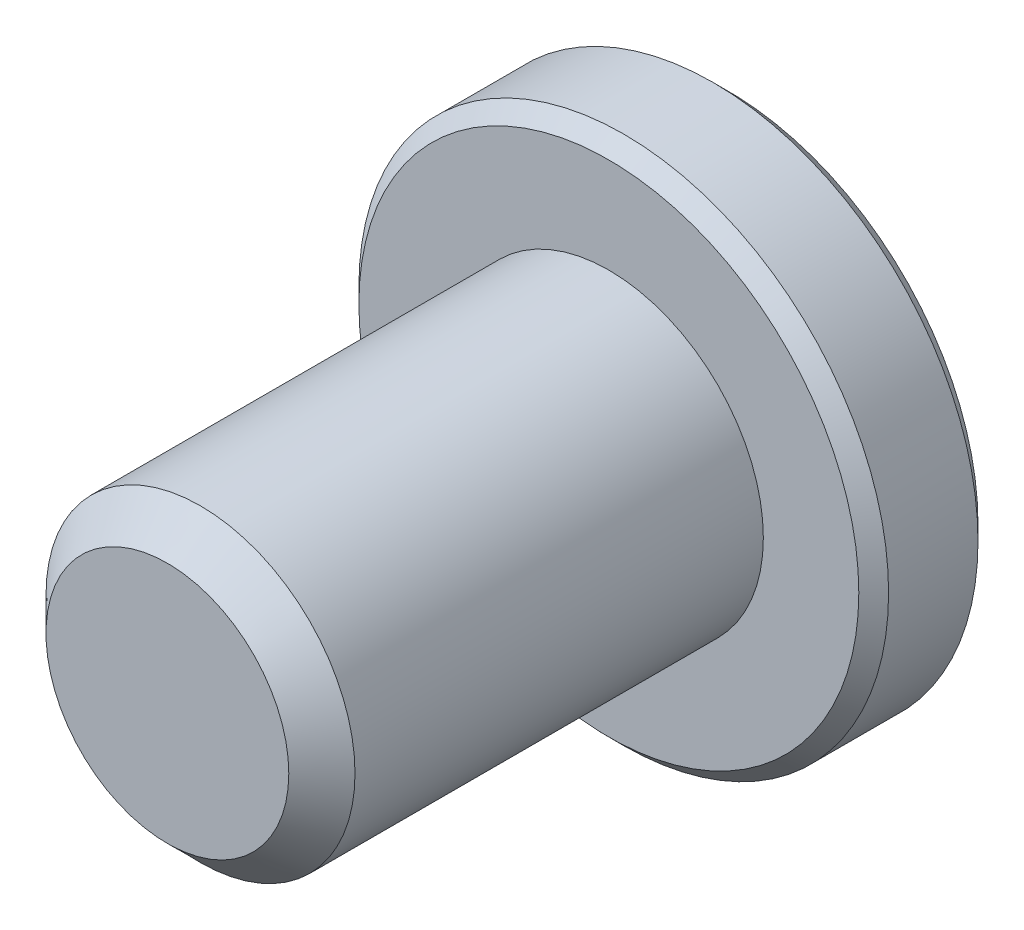
ISO-10303-21;
HEADER;
FILE_DESCRIPTION(('STEP AP214'),'2;1');
FILE_NAME('part.step','',(''),(''),'','','');
FILE_SCHEMA(('AUTOMOTIVE_DESIGN { 1 0 10303 214 1 1 1 1 }'));
ENDSEC;
DATA;
#1=APPLICATION_CONTEXT('core data for automotive mechanical design processes');
#2=APPLICATION_PROTOCOL_DEFINITION('international standard','automotive_design',2000,#1);
#3=PRODUCT_CONTEXT('',#1,'mechanical');
#4=PRODUCT('Part','Part','',(#3));
#5=PRODUCT_RELATED_PRODUCT_CATEGORY('part','',(#4));
#6=PRODUCT_DEFINITION_FORMATION('','',#4);
#7=PRODUCT_DEFINITION_CONTEXT('part definition',#1,'design');
#8=PRODUCT_DEFINITION('design','',#6,#7);
#9=PRODUCT_DEFINITION_SHAPE('','',#8);
#10=(LENGTH_UNIT() NAMED_UNIT(*) SI_UNIT(.MILLI.,.METRE.));
#11=(NAMED_UNIT(*) PLANE_ANGLE_UNIT() SI_UNIT($,.RADIAN.));
#12=(NAMED_UNIT(*) SI_UNIT($,.STERADIAN.) SOLID_ANGLE_UNIT());
#13=UNCERTAINTY_MEASURE_WITH_UNIT(LENGTH_MEASURE(1.E-05),#10,'distance_accuracy_value','');
#14=(GEOMETRIC_REPRESENTATION_CONTEXT(3) GLOBAL_UNCERTAINTY_ASSIGNED_CONTEXT((#13)) GLOBAL_UNIT_ASSIGNED_CONTEXT((#10,
#11,#12)) REPRESENTATION_CONTEXT('',''));
#15=CARTESIAN_POINT('',(0.,0.,0.));
#16=DIRECTION('',(0.,0.,1.));
#17=DIRECTION('',(1.,0.,0.));
#18=AXIS2_PLACEMENT_3D('',#15,#16,#17);
#19=CARTESIAN_POINT('',(0.,0.,-6.35));
#20=DIRECTION('',(0.,0.,1.));
#21=DIRECTION('',(1.,0.,0.));
#22=AXIS2_PLACEMENT_3D('',#19,#20,#21);
#23=PLANE('',#22);
#24=CARTESIAN_POINT('',(0.,0.,-6.35));
#25=DIRECTION('',(0.,0.,1.));
#26=DIRECTION('',(1.,0.,0.));
#27=AXIS2_PLACEMENT_3D('',#24,#25,#26);
#28=CIRCLE('',#27,5.66249999999999);
#29=CARTESIAN_POINT('',(5.66249999999999,0.,-6.35));
#30=VERTEX_POINT('',#29);
#31=EDGE_CURVE('E177',#30,#30,#28,.F.);
#32=ORIENTED_EDGE('',*,*,#31,.T.);
#33=EDGE_LOOP('',(#32));
#34=FACE_BOUND('',#33,.T.);
#35=DIRECTION('',(-0.866025403784439,0.499999999999999,0.));
#36=VECTOR('',#35,1.);
#37=CARTESIAN_POINT('',(2.25,1.29903810567666,-6.35));
#38=LINE('',#37,#36);
#39=CARTESIAN_POINT('',(2.25,1.29903810567666,-6.35));
#40=VERTEX_POINT('',#39);
#41=CARTESIAN_POINT('',(0.,2.59807621135331,-6.35));
#42=VERTEX_POINT('',#41);
#43=EDGE_CURVE('E55',#40,#42,#38,.T.);
#44=ORIENTED_EDGE('',*,*,#43,.T.);
#45=DIRECTION('',(-0.866025403784438,-0.5,0.));
#46=VECTOR('',#45,1.);
#47=CARTESIAN_POINT('',(0.,2.59807621135331,-6.35));
#48=LINE('',#47,#46);
#49=CARTESIAN_POINT('',(-2.25,1.29903810567666,-6.35));
#50=VERTEX_POINT('',#49);
#51=EDGE_CURVE('E131',#42,#50,#48,.T.);
#52=ORIENTED_EDGE('',*,*,#51,.T.);
#53=DIRECTION('',(0.,-1.,0.));
#54=VECTOR('',#53,1.);
#55=CARTESIAN_POINT('',(-2.25,1.29903810567666,-6.35));
#56=LINE('',#55,#54);
#57=CARTESIAN_POINT('',(-2.25,-1.29903810567666,-6.35));
#58=VERTEX_POINT('',#57);
#59=EDGE_CURVE('E135',#50,#58,#56,.T.);
#60=ORIENTED_EDGE('',*,*,#59,.T.);
#61=DIRECTION('',(0.866025403784439,-0.499999999999999,0.));
#62=VECTOR('',#61,1.);
#63=CARTESIAN_POINT('',(-2.25,-1.29903810567666,-6.35));
#64=LINE('',#63,#62);
#65=CARTESIAN_POINT('',(0.,-2.59807621135331,-6.35));
#66=VERTEX_POINT('',#65);
#67=EDGE_CURVE('E139',#58,#66,#64,.T.);
#68=ORIENTED_EDGE('',*,*,#67,.T.);
#69=DIRECTION('',(0.866025403784438,0.5,0.));
#70=VECTOR('',#69,1.);
#71=CARTESIAN_POINT('',(0.,-2.59807621135331,-6.35));
#72=LINE('',#71,#70);
#73=CARTESIAN_POINT('',(2.25,-1.29903810567666,-6.35));
#74=VERTEX_POINT('',#73);
#75=EDGE_CURVE('E117',#66,#74,#72,.T.);
#76=ORIENTED_EDGE('',*,*,#75,.T.);
#77=DIRECTION('',(0.,1.,0.));
#78=VECTOR('',#77,1.);
#79=CARTESIAN_POINT('',(2.25,-1.29903810567666,-6.35));
#80=LINE('',#79,#78);
#81=EDGE_CURVE('E144',#74,#40,#80,.T.);
#82=ORIENTED_EDGE('',*,*,#81,.T.);
#83=EDGE_LOOP('',(#44,#52,#60,#68,#76,#82));
#84=FACE_BOUND('',#83,.T.);
#85=ADVANCED_FACE('F39',(#34,#84),#23,.F.);
#86=CARTESIAN_POINT('',(0.,0.,6.35));
#87=DIRECTION('',(0.,0.,-1.));
#88=DIRECTION('',(-1.,0.,0.));
#89=AXIS2_PLACEMENT_3D('',#86,#87,#88);
#90=CYLINDRICAL_SURFACE('',#89,3.5);
#91=CARTESIAN_POINT('',(0.,0.,5.6));
#92=DIRECTION('',(0.,0.,1.));
#93=DIRECTION('',(1.,0.,0.));
#94=AXIS2_PLACEMENT_3D('',#91,#92,#93);
#95=CIRCLE('',#94,3.5);
#96=CARTESIAN_POINT('',(3.5,0.,5.6));
#97=VERTEX_POINT('',#96);
#98=EDGE_CURVE('E11',#97,#97,#95,.F.);
#99=ORIENTED_EDGE('',*,*,#98,.T.);
#100=EDGE_LOOP('',(#99));
#101=FACE_BOUND('',#100,.T.);
#102=CARTESIAN_POINT('',(0.,0.,-3.65));
#103=DIRECTION('',(0.,0.,1.));
#104=DIRECTION('',(1.,0.,0.));
#105=AXIS2_PLACEMENT_3D('',#102,#103,#104);
#106=CIRCLE('',#105,3.5);
#107=CARTESIAN_POINT('',(3.5,0.,-3.65));
#108=VERTEX_POINT('',#107);
#109=EDGE_CURVE('E161',#108,#108,#106,.T.);
#110=ORIENTED_EDGE('',*,*,#109,.T.);
#111=EDGE_LOOP('',(#110));
#112=FACE_BOUND('',#111,.T.);
#113=ADVANCED_FACE('F196',(#101,#112),#90,.T.);
#114=CARTESIAN_POINT('',(0.,0.,6.35));
#115=DIRECTION('',(0.,0.,1.));
#116=DIRECTION('',(1.,0.,0.));
#117=AXIS2_PLACEMENT_3D('',#114,#115,#116);
#118=PLANE('',#117);
#119=CARTESIAN_POINT('',(0.,0.,6.35));
#120=DIRECTION('',(0.,0.,1.));
#121=DIRECTION('',(1.,0.,0.));
#122=AXIS2_PLACEMENT_3D('',#119,#120,#121);
#123=CIRCLE('',#122,2.75);
#124=CARTESIAN_POINT('',(2.75,0.,6.35));
#125=VERTEX_POINT('',#124);
#126=EDGE_CURVE('E48',#125,#125,#123,.T.);
#127=ORIENTED_EDGE('',*,*,#126,.T.);
#128=EDGE_LOOP('',(#127));
#129=FACE_BOUND('',#128,.T.);
#130=ADVANCED_FACE('F184',(#129),#118,.T.);
#131=CARTESIAN_POINT('',(0.,0.,-3.65));
#132=DIRECTION('',(0.,0.,1.));
#133=DIRECTION('',(1.,0.,0.));
#134=AXIS2_PLACEMENT_3D('',#131,#132,#133);
#135=PLANE('',#134);
#136=CARTESIAN_POINT('',(0.,0.,-3.65));
#137=DIRECTION('',(0.,0.,1.));
#138=DIRECTION('',(1.,0.,0.));
#139=AXIS2_PLACEMENT_3D('',#136,#137,#138);
#140=CIRCLE('',#139,5.66250000000001);
#141=CARTESIAN_POINT('',(5.66250000000001,0.,-3.65));
#142=VERTEX_POINT('',#141);
#143=EDGE_CURVE('E165',#142,#142,#140,.T.);
#144=ORIENTED_EDGE('',*,*,#143,.T.);
#145=EDGE_LOOP('',(#144));
#146=FACE_BOUND('',#145,.T.);
#147=ORIENTED_EDGE('',*,*,#109,.F.);
#148=EDGE_LOOP('',(#147));
#149=FACE_BOUND('',#148,.T.);
#150=ADVANCED_FACE('F207',(#146,#149),#135,.T.);
#151=CARTESIAN_POINT('',(0.,0.,-3.65));
#152=DIRECTION('',(0.,0.,-1.));
#153=DIRECTION('',(-1.,0.,0.));
#154=AXIS2_PLACEMENT_3D('',#151,#152,#153);
#155=CYLINDRICAL_SURFACE('',#154,6.);
#156=CARTESIAN_POINT('',(0.,0.,-3.98749999999999));
#157=DIRECTION('',(0.,0.,1.));
#158=DIRECTION('',(1.,0.,0.));
#159=AXIS2_PLACEMENT_3D('',#156,#157,#158);
#160=CIRCLE('',#159,6.);
#161=CARTESIAN_POINT('',(-6.,0.,-3.98749999999999));
#162=VERTEX_POINT('',#161);
#163=EDGE_CURVE('E173',#162,#162,#160,.F.);
#164=CARTESIAN_POINT('',(0.,0.,-6.01249999999999));
#165=DIRECTION('',(0.,0.,1.));
#166=DIRECTION('',(1.,0.,0.));
#167=AXIS2_PLACEMENT_3D('',#164,#165,#166);
#168=CIRCLE('',#167,6.);
#169=CARTESIAN_POINT('',(-6.,0.,-6.01249999999999));
#170=VERTEX_POINT('',#169);
#171=EDGE_CURVE('E169',#170,#170,#168,.T.);
#172=CARTESIAN_POINT('',(-6.,0.,-3.98749999999999));
#173=CARTESIAN_POINT('',(-6.,0.,-4.00859374999999));
#174=CARTESIAN_POINT('',(-6.,0.,-4.02968749999999));
#175=CARTESIAN_POINT('',(-6.,0.,-4.07187499999999));
#176=CARTESIAN_POINT('',(-6.,0.,-4.09296874999999));
#177=CARTESIAN_POINT('',(-6.,0.,-4.13515624999999));
#178=CARTESIAN_POINT('',(-6.,0.,-4.15624999999999));
#179=CARTESIAN_POINT('',(-6.,0.,-4.19843749999999));
#180=CARTESIAN_POINT('',(-6.,0.,-4.21953124999999));
#181=CARTESIAN_POINT('',(-6.,0.,-4.26171874999999));
#182=CARTESIAN_POINT('',(-6.,0.,-4.28281249999999));
#183=CARTESIAN_POINT('',(-6.,0.,-4.32499999999999));
#184=CARTESIAN_POINT('',(-6.,0.,-4.34609374999999));
#185=CARTESIAN_POINT('',(-6.,0.,-4.38828124999999));
#186=CARTESIAN_POINT('',(-6.,0.,-4.40937499999999));
#187=CARTESIAN_POINT('',(-6.,0.,-4.45156249999999));
#188=CARTESIAN_POINT('',(-6.,0.,-4.47265624999999));
#189=CARTESIAN_POINT('',(-6.,0.,-4.51484374999999));
#190=CARTESIAN_POINT('',(-6.,0.,-4.53593749999999));
#191=CARTESIAN_POINT('',(-6.,0.,-4.57812499999999));
#192=CARTESIAN_POINT('',(-6.,0.,-4.59921874999999));
#193=CARTESIAN_POINT('',(-6.,0.,-4.64140624999999));
#194=CARTESIAN_POINT('',(-6.,0.,-4.66249999999999));
#195=CARTESIAN_POINT('',(-6.,0.,-4.70468749999999));
#196=CARTESIAN_POINT('',(-6.,0.,-4.72578124999999));
#197=CARTESIAN_POINT('',(-6.,0.,-4.76796874999999));
#198=CARTESIAN_POINT('',(-6.,0.,-4.78906249999999));
#199=CARTESIAN_POINT('',(-6.,0.,-4.83124999999999));
#200=CARTESIAN_POINT('',(-6.,0.,-4.85234374999999));
#201=CARTESIAN_POINT('',(-6.,0.,-4.89453124999999));
#202=CARTESIAN_POINT('',(-6.,0.,-4.91562499999999));
#203=CARTESIAN_POINT('',(-6.,0.,-4.95781249999999));
#204=CARTESIAN_POINT('',(-6.,0.,-4.97890624999999));
#205=CARTESIAN_POINT('',(-6.,0.,-5.02109374999999));
#206=CARTESIAN_POINT('',(-6.,0.,-5.04218749999999));
#207=CARTESIAN_POINT('',(-6.,0.,-5.08437499999999));
#208=CARTESIAN_POINT('',(-6.,0.,-5.10546874999999));
#209=CARTESIAN_POINT('',(-6.,0.,-5.14765624999999));
#210=CARTESIAN_POINT('',(-6.,0.,-5.16874999999999));
#211=CARTESIAN_POINT('',(-6.,0.,-5.21093749999999));
#212=CARTESIAN_POINT('',(-6.,0.,-5.23203124999999));
#213=CARTESIAN_POINT('',(-6.,0.,-5.27421874999999));
#214=CARTESIAN_POINT('',(-6.,0.,-5.29531249999999));
#215=CARTESIAN_POINT('',(-6.,0.,-5.33749999999999));
#216=CARTESIAN_POINT('',(-6.,0.,-5.35859374999999));
#217=CARTESIAN_POINT('',(-6.,0.,-5.40078124999999));
#218=CARTESIAN_POINT('',(-6.,0.,-5.42187499999999));
#219=CARTESIAN_POINT('',(-6.,0.,-5.46406249999999));
#220=CARTESIAN_POINT('',(-6.,0.,-5.48515624999999));
#221=CARTESIAN_POINT('',(-6.,0.,-5.52734374999999));
#222=CARTESIAN_POINT('',(-6.,0.,-5.54843749999999));
#223=CARTESIAN_POINT('',(-6.,0.,-5.59062499999999));
#224=CARTESIAN_POINT('',(-6.,0.,-5.61171874999999));
#225=CARTESIAN_POINT('',(-6.,0.,-5.65390624999999));
#226=CARTESIAN_POINT('',(-6.,0.,-5.67499999999999));
#227=CARTESIAN_POINT('',(-6.,0.,-5.71718749999999));
#228=CARTESIAN_POINT('',(-6.,0.,-5.73828124999999));
#229=CARTESIAN_POINT('',(-6.,0.,-5.78046874999999));
#230=CARTESIAN_POINT('',(-6.,0.,-5.80156249999999));
#231=CARTESIAN_POINT('',(-6.,0.,-5.84374999999999));
#232=CARTESIAN_POINT('',(-6.,0.,-5.86484374999999));
#233=CARTESIAN_POINT('',(-6.,0.,-5.90703124999999));
#234=CARTESIAN_POINT('',(-6.,0.,-5.92812499999999));
#235=CARTESIAN_POINT('',(-6.,0.,-5.97031249999999));
#236=CARTESIAN_POINT('',(-6.,0.,-5.99140624999999));
#237=CARTESIAN_POINT('',(-6.,0.,-6.01249999999999));
#238=B_SPLINE_CURVE_WITH_KNOTS('',3,(#172,#173,#174,#175,#176,#177,#178,#179,#180,#181,#182,
#183,#184,#185,#186,#187,#188,#189,#190,#191,#192,#193,#194,#195,#196,#197,#198,#199,#200,#201,
#202,#203,#204,#205,#206,#207,#208,#209,#210,#211,#212,#213,#214,#215,#216,#217,#218,#219,#220,
#221,#222,#223,#224,#225,#226,#227,#228,#229,#230,#231,#232,#233,#234,#235,#236,#237),
.UNSPECIFIED.,.F.,.F.,(4,2,2,2,2,2,2,2,2,2,2,2,2,2,2,2,2,2,2,2,2,2,2,2,2,2,2,2,2,2,2,2,4),(0.,
0.06328125,0.1265625,0.18984375,0.253125,0.31640625,0.3796875,0.44296875,0.50625,0.56953125,
0.6328125,0.69609375,0.759375,0.82265625,0.8859375,0.94921875,1.0125,1.07578125,1.1390625,
1.20234375,1.265625,1.32890625,1.3921875,1.45546875,1.51875,1.58203125,1.6453125,1.70859375,
1.771875,1.83515625,1.8984375,1.96171875,2.025),.UNSPECIFIED.);
#239=EDGE_CURVE('BSEAM209',#162,#170,#238,.T.);
#240=ORIENTED_EDGE('',*,*,#163,.T.);
#241=ORIENTED_EDGE('',*,*,#171,.T.);
#242=ORIENTED_EDGE('',*,*,#239,.T.);
#243=ORIENTED_EDGE('',*,*,#239,.F.);
#244=EDGE_LOOP('',(#240,#242,#241,#243));
#245=FACE_BOUND('',#244,.T.);
#246=ADVANCED_FACE('F209',(#245),#155,.T.);
#247=CARTESIAN_POINT('',(2.25,1.29903810567666,-4.325));
#248=DIRECTION('',(-0.499999999999999,-0.866025403784439,0.));
#249=DIRECTION('',(0.866025403784439,-0.499999999999999,0.));
#250=AXIS2_PLACEMENT_3D('',#247,#248,#249);
#251=PLANE('',#250);
#252=ORIENTED_EDGE('',*,*,#43,.F.);
#253=DIRECTION('',(0.,0.,-1.));
#254=VECTOR('',#253,1.);
#255=CARTESIAN_POINT('',(2.25,1.29903810567666,-4.325));
#256=LINE('',#255,#254);
#257=CARTESIAN_POINT('',(2.25,1.29903810567666,-4.325));
#258=VERTEX_POINT('',#257);
#259=EDGE_CURVE('E125',#258,#40,#256,.T.);
#260=ORIENTED_EDGE('',*,*,#259,.F.);
#261=DIRECTION('',(-0.866025403784439,0.499999999999999,0.));
#262=VECTOR('',#261,1.);
#263=CARTESIAN_POINT('',(2.25,1.29903810567666,-4.325));
#264=LINE('',#263,#262);
#265=CARTESIAN_POINT('',(0.,2.59807621135331,-4.325));
#266=VERTEX_POINT('',#265);
#267=EDGE_CURVE('E148',#258,#266,#264,.T.);
#268=ORIENTED_EDGE('',*,*,#267,.T.);
#269=DIRECTION('',(0.,0.,-1.));
#270=VECTOR('',#269,1.);
#271=CARTESIAN_POINT('',(0.,2.59807621135331,-4.325));
#272=LINE('',#271,#270);
#273=EDGE_CURVE('E158',#266,#42,#272,.T.);
#274=ORIENTED_EDGE('',*,*,#273,.T.);
#275=EDGE_LOOP('',(#252,#260,#268,#274));
#276=FACE_BOUND('',#275,.T.);
#277=ADVANCED_FACE('F212',(#276),#251,.T.);
#278=CARTESIAN_POINT('',(0.,2.59807621135331,-4.325));
#279=DIRECTION('',(0.5,-0.866025403784438,0.));
#280=DIRECTION('',(0.866025403784438,0.5,0.));
#281=AXIS2_PLACEMENT_3D('',#278,#279,#280);
#282=PLANE('',#281);
#283=ORIENTED_EDGE('',*,*,#51,.F.);
#284=ORIENTED_EDGE('',*,*,#273,.F.);
#285=DIRECTION('',(-0.866025403784438,-0.5,0.));
#286=VECTOR('',#285,1.);
#287=CARTESIAN_POINT('',(0.,2.59807621135331,-4.325));
#288=LINE('',#287,#286);
#289=CARTESIAN_POINT('',(-2.25,1.29903810567666,-4.325));
#290=VERTEX_POINT('',#289);
#291=EDGE_CURVE('E94',#266,#290,#288,.T.);
#292=ORIENTED_EDGE('',*,*,#291,.T.);
#293=DIRECTION('',(0.,0.,-1.));
#294=VECTOR('',#293,1.);
#295=CARTESIAN_POINT('',(-2.25,1.29903810567666,-4.325));
#296=LINE('',#295,#294);
#297=EDGE_CURVE('E155',#290,#50,#296,.T.);
#298=ORIENTED_EDGE('',*,*,#297,.T.);
#299=EDGE_LOOP('',(#283,#284,#292,#298));
#300=FACE_BOUND('',#299,.T.);
#301=ADVANCED_FACE('F245',(#300),#282,.T.);
#302=CARTESIAN_POINT('',(-2.25,1.29903810567666,-4.325));
#303=DIRECTION('',(1.,0.,0.));
#304=DIRECTION('',(0.,0.,-1.));
#305=AXIS2_PLACEMENT_3D('',#302,#303,#304);
#306=PLANE('',#305);
#307=ORIENTED_EDGE('',*,*,#59,.F.);
#308=ORIENTED_EDGE('',*,*,#297,.F.);
#309=DIRECTION('',(0.,-1.,0.));
#310=VECTOR('',#309,1.);
#311=CARTESIAN_POINT('',(-2.25,1.29903810567666,-4.325));
#312=LINE('',#311,#310);
#313=CARTESIAN_POINT('',(-2.25,-1.29903810567666,-4.325));
#314=VERTEX_POINT('',#313);
#315=EDGE_CURVE('E113',#290,#314,#312,.T.);
#316=ORIENTED_EDGE('',*,*,#315,.T.);
#317=DIRECTION('',(0.,0.,-1.));
#318=VECTOR('',#317,1.);
#319=CARTESIAN_POINT('',(-2.25,-1.29903810567666,-4.325));
#320=LINE('',#319,#318);
#321=EDGE_CURVE('E109',#314,#58,#320,.T.);
#322=ORIENTED_EDGE('',*,*,#321,.T.);
#323=EDGE_LOOP('',(#307,#308,#316,#322));
#324=FACE_BOUND('',#323,.T.);
#325=ADVANCED_FACE('F251',(#324),#306,.T.);
#326=CARTESIAN_POINT('',(-2.25,-1.29903810567666,-4.325));
#327=DIRECTION('',(0.499999999999999,0.866025403784439,0.));
#328=DIRECTION('',(-0.866025403784439,0.5,0.));
#329=AXIS2_PLACEMENT_3D('',#326,#327,#328);
#330=PLANE('',#329);
#331=ORIENTED_EDGE('',*,*,#67,.F.);
#332=ORIENTED_EDGE('',*,*,#321,.F.);
#333=DIRECTION('',(0.866025403784439,-0.499999999999999,0.));
#334=VECTOR('',#333,1.);
#335=CARTESIAN_POINT('',(-2.25,-1.29903810567666,-4.325));
#336=LINE('',#335,#334);
#337=CARTESIAN_POINT('',(0.,-2.59807621135331,-4.325));
#338=VERTEX_POINT('',#337);
#339=EDGE_CURVE('E104',#314,#338,#336,.T.);
#340=ORIENTED_EDGE('',*,*,#339,.T.);
#341=DIRECTION('',(0.,0.,-1.));
#342=VECTOR('',#341,1.);
#343=CARTESIAN_POINT('',(0.,-2.59807621135331,-4.325));
#344=LINE('',#343,#342);
#345=EDGE_CURVE('E108',#338,#66,#344,.T.);
#346=ORIENTED_EDGE('',*,*,#345,.T.);
#347=EDGE_LOOP('',(#331,#332,#340,#346));
#348=FACE_BOUND('',#347,.T.);
#349=ADVANCED_FACE('F107',(#348),#330,.T.);
#350=CARTESIAN_POINT('',(0.,-2.59807621135331,-4.325));
#351=DIRECTION('',(-0.5,0.866025403784438,0.));
#352=DIRECTION('',(-0.866025403784438,-0.5,0.));
#353=AXIS2_PLACEMENT_3D('',#350,#351,#352);
#354=PLANE('',#353);
#355=ORIENTED_EDGE('',*,*,#75,.F.);
#356=ORIENTED_EDGE('',*,*,#345,.F.);
#357=DIRECTION('',(0.866025403784438,0.5,0.));
#358=VECTOR('',#357,1.);
#359=CARTESIAN_POINT('',(0.,-2.59807621135331,-4.325));
#360=LINE('',#359,#358);
#361=CARTESIAN_POINT('',(2.25,-1.29903810567666,-4.325));
#362=VERTEX_POINT('',#361);
#363=EDGE_CURVE('E112',#338,#362,#360,.T.);
#364=ORIENTED_EDGE('',*,*,#363,.T.);
#365=DIRECTION('',(0.,0.,-1.));
#366=VECTOR('',#365,1.);
#367=CARTESIAN_POINT('',(2.25,-1.29903810567666,-4.325));
#368=LINE('',#367,#366);
#369=EDGE_CURVE('E85',#362,#74,#368,.T.);
#370=ORIENTED_EDGE('',*,*,#369,.T.);
#371=EDGE_LOOP('',(#355,#356,#364,#370));
#372=FACE_BOUND('',#371,.T.);
#373=ADVANCED_FACE('F115',(#372),#354,.T.);
#374=CARTESIAN_POINT('',(2.25,-1.29903810567666,-4.325));
#375=DIRECTION('',(-1.,0.,0.));
#376=DIRECTION('',(0.,-1.,0.));
#377=AXIS2_PLACEMENT_3D('',#374,#375,#376);
#378=PLANE('',#377);
#379=ORIENTED_EDGE('',*,*,#81,.F.);
#380=ORIENTED_EDGE('',*,*,#369,.F.);
#381=DIRECTION('',(0.,1.,0.));
#382=VECTOR('',#381,1.);
#383=CARTESIAN_POINT('',(2.25,-1.29903810567666,-4.325));
#384=LINE('',#383,#382);
#385=EDGE_CURVE('E63',#362,#258,#384,.T.);
#386=ORIENTED_EDGE('',*,*,#385,.T.);
#387=ORIENTED_EDGE('',*,*,#259,.T.);
#388=EDGE_LOOP('',(#379,#380,#386,#387));
#389=FACE_BOUND('',#388,.T.);
#390=ADVANCED_FACE('F221',(#389),#378,.T.);
#391=CARTESIAN_POINT('',(-2.25,3.89711431702997,-4.325));
#392=DIRECTION('',(0.,0.,1.));
#393=DIRECTION('',(1.,0.,0.));
#394=AXIS2_PLACEMENT_3D('',#391,#392,#393);
#395=PLANE('',#394);
#396=ORIENTED_EDGE('',*,*,#267,.F.);
#397=ORIENTED_EDGE('',*,*,#385,.F.);
#398=ORIENTED_EDGE('',*,*,#363,.F.);
#399=ORIENTED_EDGE('',*,*,#339,.F.);
#400=ORIENTED_EDGE('',*,*,#315,.F.);
#401=ORIENTED_EDGE('',*,*,#291,.F.);
#402=EDGE_LOOP('',(#396,#397,#398,#399,#400,#401));
#403=FACE_BOUND('',#402,.T.);
#404=ADVANCED_FACE('F121',(#403),#395,.F.);
#405=CARTESIAN_POINT('',(0.,0.,-3.65));
#406=DIRECTION('',(0.,0.,-1.));
#407=DIRECTION('',(-1.,0.,0.));
#408=AXIS2_PLACEMENT_3D('',#405,#406,#407);
#409=CONICAL_SURFACE('',#408,5.66250000000001,0.785398163397451);
#410=ORIENTED_EDGE('',*,*,#163,.F.);
#411=EDGE_LOOP('',(#410));
#412=FACE_BOUND('',#411,.T.);
#413=ORIENTED_EDGE('',*,*,#143,.F.);
#414=EDGE_LOOP('',(#413));
#415=FACE_BOUND('',#414,.T.);
#416=ADVANCED_FACE('F192',(#412,#415),#409,.T.);
#417=CARTESIAN_POINT('',(0.,0.,-6.01249999999999));
#418=DIRECTION('',(0.,0.,1.));
#419=DIRECTION('',(1.,0.,0.));
#420=AXIS2_PLACEMENT_3D('',#417,#418,#419);
#421=CONICAL_SURFACE('',#420,6.,0.785398163397447);
#422=ORIENTED_EDGE('',*,*,#31,.F.);
#423=EDGE_LOOP('',(#422));
#424=FACE_BOUND('',#423,.T.);
#425=ORIENTED_EDGE('',*,*,#171,.F.);
#426=EDGE_LOOP('',(#425));
#427=FACE_BOUND('',#426,.T.);
#428=ADVANCED_FACE('F187',(#424,#427),#421,.T.);
#429=CARTESIAN_POINT('',(0.,0.,6.35));
#430=DIRECTION('',(0.,0.,-1.));
#431=DIRECTION('',(-1.,0.,0.));
#432=AXIS2_PLACEMENT_3D('',#429,#430,#431);
#433=CONICAL_SURFACE('',#432,2.75,0.785398163397447);
#434=ORIENTED_EDGE('',*,*,#98,.F.);
#435=EDGE_LOOP('',(#434));
#436=FACE_BOUND('',#435,.T.);
#437=ORIENTED_EDGE('',*,*,#126,.F.);
#438=EDGE_LOOP('',(#437));
#439=FACE_BOUND('',#438,.T.);
#440=ADVANCED_FACE('F41',(#436,#439),#433,.T.);
#441=CLOSED_SHELL('',(#85,#113,#130,#150,#246,#277,#301,#325,#349,#373,#390,#404,#416,#428,#440));
#442=MANIFOLD_SOLID_BREP('B2',#441);
#443=ADVANCED_BREP_SHAPE_REPRESENTATION('',(#18,#442),#14);
#444=SHAPE_DEFINITION_REPRESENTATION(#9,#443);
ENDSEC;
END-ISO-10303-21;
